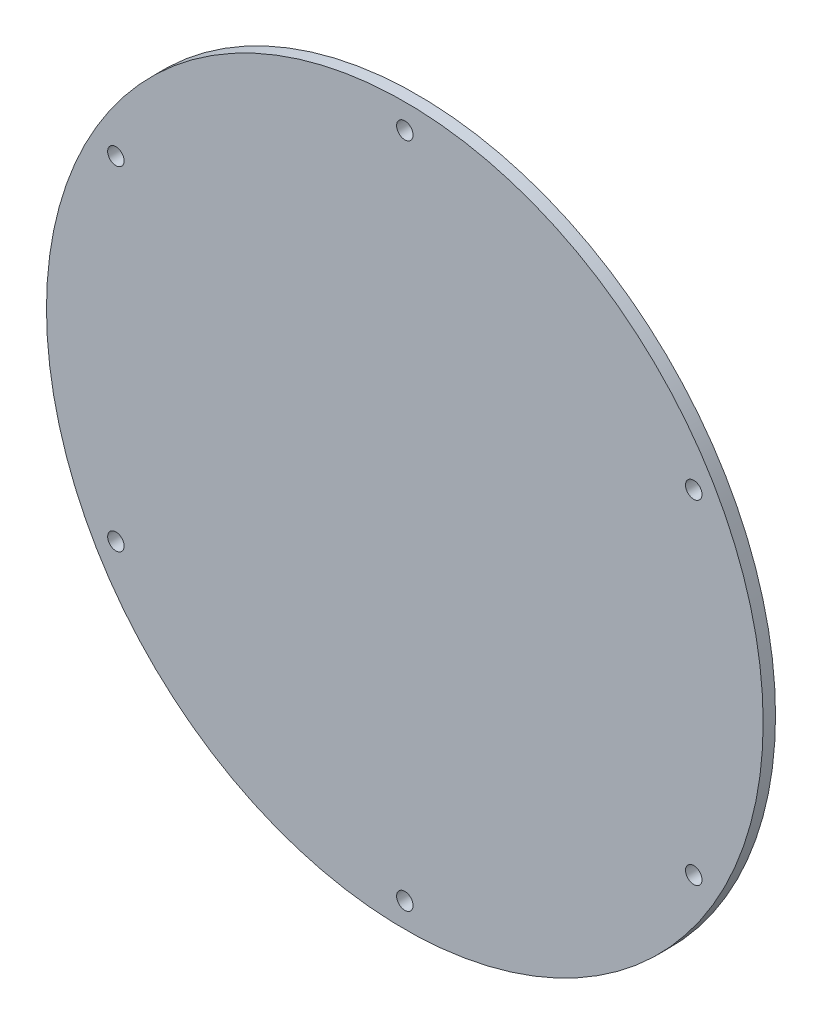
ISO-10303-21;
HEADER;
FILE_DESCRIPTION(('STEP AP214'),'2;1');
FILE_NAME('part.step','',(''),(''),'','','');
FILE_SCHEMA(('AUTOMOTIVE_DESIGN { 1 0 10303 214 1 1 1 1 }'));
ENDSEC;
DATA;
#1=APPLICATION_CONTEXT('core data for automotive mechanical design processes');
#2=APPLICATION_PROTOCOL_DEFINITION('international standard','automotive_design',2000,#1);
#3=PRODUCT_CONTEXT('',#1,'mechanical');
#4=PRODUCT('Part','Part','',(#3));
#5=PRODUCT_RELATED_PRODUCT_CATEGORY('part','',(#4));
#6=PRODUCT_DEFINITION_FORMATION('','',#4);
#7=PRODUCT_DEFINITION_CONTEXT('part definition',#1,'design');
#8=PRODUCT_DEFINITION('design','',#6,#7);
#9=PRODUCT_DEFINITION_SHAPE('','',#8);
#10=(LENGTH_UNIT() NAMED_UNIT(*) SI_UNIT(.MILLI.,.METRE.));
#11=(NAMED_UNIT(*) PLANE_ANGLE_UNIT() SI_UNIT($,.RADIAN.));
#12=(NAMED_UNIT(*) SI_UNIT($,.STERADIAN.) SOLID_ANGLE_UNIT());
#13=UNCERTAINTY_MEASURE_WITH_UNIT(LENGTH_MEASURE(1.E-05),#10,'distance_accuracy_value','');
#14=(GEOMETRIC_REPRESENTATION_CONTEXT(3) GLOBAL_UNCERTAINTY_ASSIGNED_CONTEXT((#13)) GLOBAL_UNIT_ASSIGNED_CONTEXT((#10,
#11,#12)) REPRESENTATION_CONTEXT('',''));
#15=CARTESIAN_POINT('',(0.,0.,0.));
#16=DIRECTION('',(0.,0.,1.));
#17=DIRECTION('',(1.,0.,0.));
#18=AXIS2_PLACEMENT_3D('',#15,#16,#17);
#19=CARTESIAN_POINT('',(0.,0.,6.));
#20=DIRECTION('',(0.,0.,1.));
#21=DIRECTION('',(1.,0.,0.));
#22=AXIS2_PLACEMENT_3D('',#19,#20,#21);
#23=PLANE('',#22);
#24=CARTESIAN_POINT('',(-140.296115413069,-81.000000000006,6.));
#25=DIRECTION('',(0.,0.,1.));
#26=DIRECTION('',(1.,0.,0.));
#27=AXIS2_PLACEMENT_3D('',#24,#25,#26);
#28=CIRCLE('',#27,4.0000000000131);
#29=CARTESIAN_POINT('',(-136.296115413056,-81.000000000006,6.));
#30=VERTEX_POINT('',#29);
#31=EDGE_CURVE('E71',#30,#30,#28,.T.);
#32=ORIENTED_EDGE('',*,*,#31,.F.);
#33=EDGE_LOOP('',(#32));
#34=FACE_BOUND('',#33,.T.);
#35=CARTESIAN_POINT('',(140.296115413089,-80.999999999994,6.));
#36=DIRECTION('',(0.,0.,1.));
#37=DIRECTION('',(1.,0.,0.));
#38=AXIS2_PLACEMENT_3D('',#35,#36,#37);
#39=CIRCLE('',#38,4.00000000000888);
#40=CARTESIAN_POINT('',(144.296115413098,-80.999999999994,6.));
#41=VERTEX_POINT('',#40);
#42=EDGE_CURVE('E59',#41,#41,#39,.T.);
#43=ORIENTED_EDGE('',*,*,#42,.F.);
#44=EDGE_LOOP('',(#43));
#45=FACE_BOUND('',#44,.T.);
#46=CARTESIAN_POINT('',(0.,162.,6.));
#47=DIRECTION('',(0.,0.,1.));
#48=DIRECTION('',(1.,0.,0.));
#49=AXIS2_PLACEMENT_3D('',#46,#47,#48);
#50=CIRCLE('',#49,4.);
#51=CARTESIAN_POINT('',(4.,162.,6.));
#52=VERTEX_POINT('',#51);
#53=EDGE_CURVE('E48',#52,#52,#50,.T.);
#54=ORIENTED_EDGE('',*,*,#53,.F.);
#55=EDGE_LOOP('',(#54));
#56=FACE_BOUND('',#55,.T.);
#57=CARTESIAN_POINT('',(0.,0.,6.));
#58=DIRECTION('',(0.,0.,1.));
#59=DIRECTION('',(1.,0.,0.));
#60=AXIS2_PLACEMENT_3D('',#57,#58,#59);
#61=CIRCLE('',#60,174.);
#62=CARTESIAN_POINT('',(174.,0.,6.));
#63=VERTEX_POINT('',#62);
#64=EDGE_CURVE('E10',#63,#63,#61,.T.);
#65=ORIENTED_EDGE('',*,*,#64,.T.);
#66=EDGE_LOOP('',(#65));
#67=FACE_BOUND('',#66,.T.);
#68=CARTESIAN_POINT('',(140.296115413082,81.000000000006,6.));
#69=DIRECTION('',(0.,0.,1.));
#70=DIRECTION('',(1.,0.,0.));
#71=AXIS2_PLACEMENT_3D('',#68,#69,#70);
#72=CIRCLE('',#71,4.00000000000197);
#73=CARTESIAN_POINT('',(144.296115413084,81.000000000006,6.));
#74=VERTEX_POINT('',#73);
#75=EDGE_CURVE('E53',#74,#74,#72,.T.);
#76=ORIENTED_EDGE('',*,*,#75,.F.);
#77=EDGE_LOOP('',(#76));
#78=FACE_BOUND('',#77,.T.);
#79=CARTESIAN_POINT('',(1.37549025248968E-11,-162.,6.));
#80=DIRECTION('',(0.,0.,1.));
#81=DIRECTION('',(1.,0.,0.));
#82=AXIS2_PLACEMENT_3D('',#79,#80,#81);
#83=CIRCLE('',#82,4.00000000001424);
#84=CARTESIAN_POINT('',(4.00000000002799,-162.,6.));
#85=VERTEX_POINT('',#84);
#86=EDGE_CURVE('E65',#85,#85,#83,.T.);
#87=ORIENTED_EDGE('',*,*,#86,.F.);
#88=EDGE_LOOP('',(#87));
#89=FACE_BOUND('',#88,.T.);
#90=CARTESIAN_POINT('',(-140.296115413076,80.9999999999939,6.));
#91=DIRECTION('',(0.,0.,1.));
#92=DIRECTION('',(1.,0.,0.));
#93=AXIS2_PLACEMENT_3D('',#90,#91,#92);
#94=CIRCLE('',#93,4.00000000000697);
#95=CARTESIAN_POINT('',(-136.296115413069,80.9999999999939,6.));
#96=VERTEX_POINT('',#95);
#97=EDGE_CURVE('E77',#96,#96,#94,.T.);
#98=ORIENTED_EDGE('',*,*,#97,.F.);
#99=EDGE_LOOP('',(#98));
#100=FACE_BOUND('',#99,.T.);
#101=ADVANCED_FACE('F37',(#34,#45,#56,#67,#78,#89,#100),#23,.T.);
#102=CARTESIAN_POINT('',(0.,0.,0.));
#103=DIRECTION('',(0.,0.,1.));
#104=DIRECTION('',(1.,0.,0.));
#105=AXIS2_PLACEMENT_3D('',#102,#103,#104);
#106=PLANE('',#105);
#107=CARTESIAN_POINT('',(0.,0.,0.));
#108=DIRECTION('',(0.,0.,1.));
#109=DIRECTION('',(1.,0.,0.));
#110=AXIS2_PLACEMENT_3D('',#107,#108,#109);
#111=CIRCLE('',#110,174.);
#112=CARTESIAN_POINT('',(174.,0.,0.));
#113=VERTEX_POINT('',#112);
#114=EDGE_CURVE('E41',#113,#113,#111,.T.);
#115=ORIENTED_EDGE('',*,*,#114,.F.);
#116=EDGE_LOOP('',(#115));
#117=FACE_BOUND('',#116,.T.);
#118=CARTESIAN_POINT('',(0.,162.,0.));
#119=DIRECTION('',(0.,0.,1.));
#120=DIRECTION('',(1.,0.,0.));
#121=AXIS2_PLACEMENT_3D('',#118,#119,#120);
#122=CIRCLE('',#121,4.);
#123=CARTESIAN_POINT('',(4.,162.,0.));
#124=VERTEX_POINT('',#123);
#125=EDGE_CURVE('E50',#124,#124,#122,.T.);
#126=ORIENTED_EDGE('',*,*,#125,.T.);
#127=EDGE_LOOP('',(#126));
#128=FACE_BOUND('',#127,.T.);
#129=CARTESIAN_POINT('',(140.296115413082,81.000000000006,0.));
#130=DIRECTION('',(0.,0.,1.));
#131=DIRECTION('',(1.,0.,0.));
#132=AXIS2_PLACEMENT_3D('',#129,#130,#131);
#133=CIRCLE('',#132,4.00000000000197);
#134=CARTESIAN_POINT('',(144.296115413084,81.000000000006,0.));
#135=VERTEX_POINT('',#134);
#136=EDGE_CURVE('E56',#135,#135,#133,.T.);
#137=ORIENTED_EDGE('',*,*,#136,.T.);
#138=EDGE_LOOP('',(#137));
#139=FACE_BOUND('',#138,.T.);
#140=CARTESIAN_POINT('',(140.296115413089,-80.999999999994,0.));
#141=DIRECTION('',(0.,0.,1.));
#142=DIRECTION('',(1.,0.,0.));
#143=AXIS2_PLACEMENT_3D('',#140,#141,#142);
#144=CIRCLE('',#143,4.00000000000888);
#145=CARTESIAN_POINT('',(144.296115413098,-80.999999999994,0.));
#146=VERTEX_POINT('',#145);
#147=EDGE_CURVE('E62',#146,#146,#144,.T.);
#148=ORIENTED_EDGE('',*,*,#147,.T.);
#149=EDGE_LOOP('',(#148));
#150=FACE_BOUND('',#149,.T.);
#151=CARTESIAN_POINT('',(1.37549025248968E-11,-162.,0.));
#152=DIRECTION('',(0.,0.,1.));
#153=DIRECTION('',(1.,0.,0.));
#154=AXIS2_PLACEMENT_3D('',#151,#152,#153);
#155=CIRCLE('',#154,4.00000000001424);
#156=CARTESIAN_POINT('',(4.00000000002799,-162.,0.));
#157=VERTEX_POINT('',#156);
#158=EDGE_CURVE('E68',#157,#157,#155,.T.);
#159=ORIENTED_EDGE('',*,*,#158,.T.);
#160=EDGE_LOOP('',(#159));
#161=FACE_BOUND('',#160,.T.);
#162=CARTESIAN_POINT('',(-140.296115413069,-81.000000000006,0.));
#163=DIRECTION('',(0.,0.,1.));
#164=DIRECTION('',(1.,0.,0.));
#165=AXIS2_PLACEMENT_3D('',#162,#163,#164);
#166=CIRCLE('',#165,4.0000000000131);
#167=CARTESIAN_POINT('',(-136.296115413056,-81.000000000006,0.));
#168=VERTEX_POINT('',#167);
#169=EDGE_CURVE('E74',#168,#168,#166,.T.);
#170=ORIENTED_EDGE('',*,*,#169,.T.);
#171=EDGE_LOOP('',(#170));
#172=FACE_BOUND('',#171,.T.);
#173=CARTESIAN_POINT('',(-140.296115413076,80.9999999999939,0.));
#174=DIRECTION('',(0.,0.,1.));
#175=DIRECTION('',(1.,0.,0.));
#176=AXIS2_PLACEMENT_3D('',#173,#174,#175);
#177=CIRCLE('',#176,4.00000000000697);
#178=CARTESIAN_POINT('',(-136.296115413069,80.9999999999939,0.));
#179=VERTEX_POINT('',#178);
#180=EDGE_CURVE('E80',#179,#179,#177,.T.);
#181=ORIENTED_EDGE('',*,*,#180,.T.);
#182=EDGE_LOOP('',(#181));
#183=FACE_BOUND('',#182,.T.);
#184=ADVANCED_FACE('F90',(#117,#128,#139,#150,#161,#172,#183),#106,.F.);
#185=CARTESIAN_POINT('',(0.,0.,6.));
#186=DIRECTION('',(0.,0.,-1.));
#187=DIRECTION('',(-1.,0.,0.));
#188=AXIS2_PLACEMENT_3D('',#185,#186,#187);
#189=CYLINDRICAL_SURFACE('',#188,174.);
#190=ORIENTED_EDGE('',*,*,#64,.F.);
#191=EDGE_LOOP('',(#190));
#192=FACE_BOUND('',#191,.T.);
#193=ORIENTED_EDGE('',*,*,#114,.T.);
#194=EDGE_LOOP('',(#193));
#195=FACE_BOUND('',#194,.T.);
#196=ADVANCED_FACE('F39',(#192,#195),#189,.T.);
#197=CARTESIAN_POINT('',(0.,162.,6.));
#198=DIRECTION('',(0.,0.,-1.));
#199=DIRECTION('',(-1.,0.,0.));
#200=AXIS2_PLACEMENT_3D('',#197,#198,#199);
#201=CYLINDRICAL_SURFACE('',#200,4.);
#202=ORIENTED_EDGE('',*,*,#53,.T.);
#203=EDGE_LOOP('',(#202));
#204=FACE_BOUND('',#203,.T.);
#205=ORIENTED_EDGE('',*,*,#125,.F.);
#206=EDGE_LOOP('',(#205));
#207=FACE_BOUND('',#206,.T.);
#208=ADVANCED_FACE('F100',(#204,#207),#201,.F.);
#209=CARTESIAN_POINT('',(140.296115413082,81.000000000006,6.));
#210=DIRECTION('',(0.,0.,-1.));
#211=DIRECTION('',(-1.,0.,0.));
#212=AXIS2_PLACEMENT_3D('',#209,#210,#211);
#213=CYLINDRICAL_SURFACE('',#212,4.00000000000197);
#214=ORIENTED_EDGE('',*,*,#75,.T.);
#215=EDGE_LOOP('',(#214));
#216=FACE_BOUND('',#215,.T.);
#217=ORIENTED_EDGE('',*,*,#136,.F.);
#218=EDGE_LOOP('',(#217));
#219=FACE_BOUND('',#218,.T.);
#220=ADVANCED_FACE('F103',(#216,#219),#213,.F.);
#221=CARTESIAN_POINT('',(140.296115413089,-80.999999999994,6.));
#222=DIRECTION('',(0.,0.,-1.));
#223=DIRECTION('',(-1.,0.,0.));
#224=AXIS2_PLACEMENT_3D('',#221,#222,#223);
#225=CYLINDRICAL_SURFACE('',#224,4.00000000000888);
#226=ORIENTED_EDGE('',*,*,#42,.T.);
#227=EDGE_LOOP('',(#226));
#228=FACE_BOUND('',#227,.T.);
#229=ORIENTED_EDGE('',*,*,#147,.F.);
#230=EDGE_LOOP('',(#229));
#231=FACE_BOUND('',#230,.T.);
#232=ADVANCED_FACE('F107',(#228,#231),#225,.F.);
#233=CARTESIAN_POINT('',(1.37549025248968E-11,-162.,6.));
#234=DIRECTION('',(0.,0.,-1.));
#235=DIRECTION('',(-1.,0.,0.));
#236=AXIS2_PLACEMENT_3D('',#233,#234,#235);
#237=CYLINDRICAL_SURFACE('',#236,4.00000000001424);
#238=ORIENTED_EDGE('',*,*,#86,.T.);
#239=EDGE_LOOP('',(#238));
#240=FACE_BOUND('',#239,.T.);
#241=ORIENTED_EDGE('',*,*,#158,.F.);
#242=EDGE_LOOP('',(#241));
#243=FACE_BOUND('',#242,.T.);
#244=ADVANCED_FACE('F111',(#240,#243),#237,.F.);
#245=CARTESIAN_POINT('',(-140.296115413069,-81.000000000006,6.));
#246=DIRECTION('',(0.,0.,-1.));
#247=DIRECTION('',(-1.,0.,0.));
#248=AXIS2_PLACEMENT_3D('',#245,#246,#247);
#249=CYLINDRICAL_SURFACE('',#248,4.0000000000131);
#250=ORIENTED_EDGE('',*,*,#31,.T.);
#251=EDGE_LOOP('',(#250));
#252=FACE_BOUND('',#251,.T.);
#253=ORIENTED_EDGE('',*,*,#169,.F.);
#254=EDGE_LOOP('',(#253));
#255=FACE_BOUND('',#254,.T.);
#256=ADVANCED_FACE('F115',(#252,#255),#249,.F.);
#257=CARTESIAN_POINT('',(-140.296115413076,80.9999999999939,6.));
#258=DIRECTION('',(0.,0.,-1.));
#259=DIRECTION('',(-1.,0.,0.));
#260=AXIS2_PLACEMENT_3D('',#257,#258,#259);
#261=CYLINDRICAL_SURFACE('',#260,4.00000000000697);
#262=ORIENTED_EDGE('',*,*,#97,.T.);
#263=EDGE_LOOP('',(#262));
#264=FACE_BOUND('',#263,.T.);
#265=ORIENTED_EDGE('',*,*,#180,.F.);
#266=EDGE_LOOP('',(#265));
#267=FACE_BOUND('',#266,.T.);
#268=ADVANCED_FACE('F86',(#264,#267),#261,.F.);
#269=CLOSED_SHELL('',(#101,#184,#196,#208,#220,#232,#244,#256,#268));
#270=MANIFOLD_SOLID_BREP('B2',#269);
#271=ADVANCED_BREP_SHAPE_REPRESENTATION('',(#18,#270),#14);
#272=SHAPE_DEFINITION_REPRESENTATION(#9,#271);
ENDSEC;
END-ISO-10303-21;
